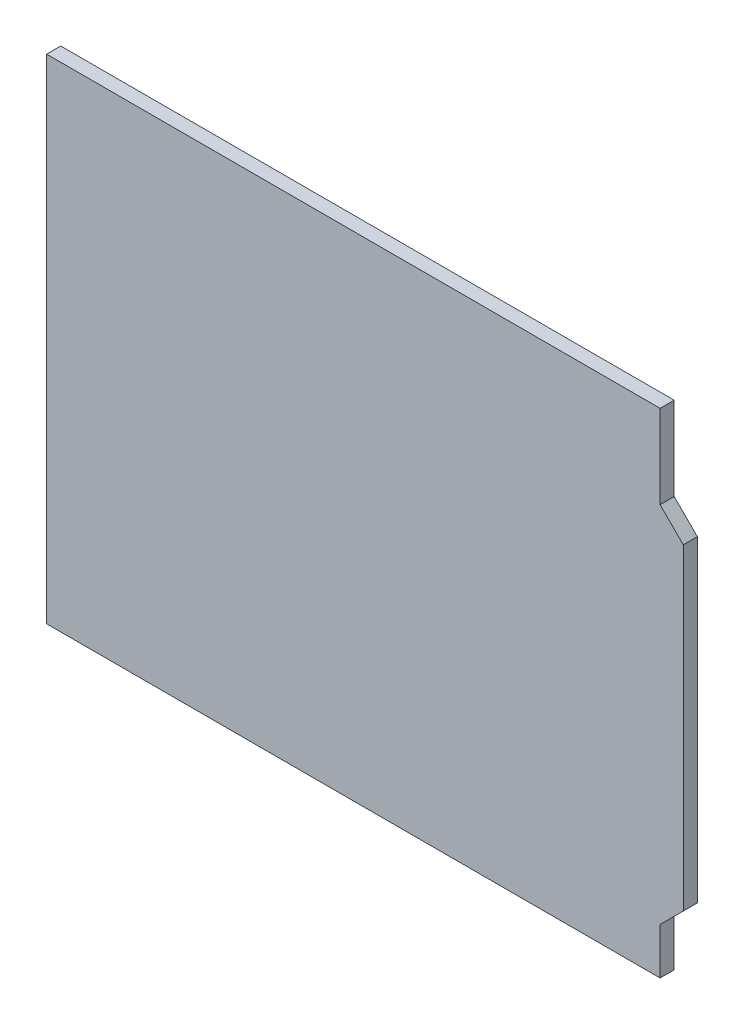
ISO-10303-21;
HEADER;
FILE_DESCRIPTION(('STEP AP214'),'2;1');
FILE_NAME('part.step','',(''),(''),'','','');
FILE_SCHEMA(('AUTOMOTIVE_DESIGN { 1 0 10303 214 1 1 1 1 }'));
ENDSEC;
DATA;
#1=APPLICATION_CONTEXT('core data for automotive mechanical design processes');
#2=APPLICATION_PROTOCOL_DEFINITION('international standard','automotive_design',2000,#1);
#3=PRODUCT_CONTEXT('',#1,'mechanical');
#4=PRODUCT('Part','Part','',(#3));
#5=PRODUCT_RELATED_PRODUCT_CATEGORY('part','',(#4));
#6=PRODUCT_DEFINITION_FORMATION('','',#4);
#7=PRODUCT_DEFINITION_CONTEXT('part definition',#1,'design');
#8=PRODUCT_DEFINITION('design','',#6,#7);
#9=PRODUCT_DEFINITION_SHAPE('','',#8);
#10=(LENGTH_UNIT() NAMED_UNIT(*) SI_UNIT(.MILLI.,.METRE.));
#11=(NAMED_UNIT(*) PLANE_ANGLE_UNIT() SI_UNIT($,.RADIAN.));
#12=(NAMED_UNIT(*) SI_UNIT($,.STERADIAN.) SOLID_ANGLE_UNIT());
#13=UNCERTAINTY_MEASURE_WITH_UNIT(LENGTH_MEASURE(1.E-05),#10,'distance_accuracy_value','');
#14=(GEOMETRIC_REPRESENTATION_CONTEXT(3) GLOBAL_UNCERTAINTY_ASSIGNED_CONTEXT((#13)) GLOBAL_UNIT_ASSIGNED_CONTEXT((#10,
#11,#12)) REPRESENTATION_CONTEXT('',''));
#15=CARTESIAN_POINT('',(0.,0.,0.));
#16=DIRECTION('',(0.,0.,1.));
#17=DIRECTION('',(1.,0.,0.));
#18=AXIS2_PLACEMENT_3D('',#15,#16,#17);
#19=CARTESIAN_POINT('',(-68.66,0.,1.52));
#20=DIRECTION('',(1.,0.,0.));
#21=DIRECTION('',(0.,0.,-1.));
#22=AXIS2_PLACEMENT_3D('',#19,#20,#21);
#23=PLANE('',#22);
#24=DIRECTION('',(0.,-1.,0.));
#25=VECTOR('',#24,1.);
#26=CARTESIAN_POINT('',(-68.66,0.,0.));
#27=LINE('',#26,#25);
#28=CARTESIAN_POINT('',(-68.66,53.21,0.));
#29=VERTEX_POINT('',#28);
#30=CARTESIAN_POINT('',(-68.66,0.,0.));
#31=VERTEX_POINT('',#30);
#32=EDGE_CURVE('E129',#29,#31,#27,.T.);
#33=ORIENTED_EDGE('',*,*,#32,.T.);
#34=DIRECTION('',(0.,0.,-1.));
#35=VECTOR('',#34,1.);
#36=CARTESIAN_POINT('',(-68.66,0.,1.52));
#37=LINE('',#36,#35);
#38=CARTESIAN_POINT('',(-68.66,0.,1.52));
#39=VERTEX_POINT('',#38);
#40=EDGE_CURVE('E11',#39,#31,#37,.T.);
#41=ORIENTED_EDGE('',*,*,#40,.F.);
#42=DIRECTION('',(0.,-1.,0.));
#43=VECTOR('',#42,1.);
#44=CARTESIAN_POINT('',(-68.66,0.,1.52));
#45=LINE('',#44,#43);
#46=CARTESIAN_POINT('',(-68.66,53.21,1.52));
#47=VERTEX_POINT('',#46);
#48=EDGE_CURVE('E143',#47,#39,#45,.T.);
#49=ORIENTED_EDGE('',*,*,#48,.F.);
#50=DIRECTION('',(0.,0.,-1.));
#51=VECTOR('',#50,1.);
#52=CARTESIAN_POINT('',(-68.66,53.21,1.52));
#53=LINE('',#52,#51);
#54=EDGE_CURVE('E125',#47,#29,#53,.T.);
#55=ORIENTED_EDGE('',*,*,#54,.T.);
#56=EDGE_LOOP('',(#33,#41,#49,#55));
#57=FACE_BOUND('',#56,.T.);
#58=ADVANCED_FACE('F33',(#57),#23,.F.);
#59=CARTESIAN_POINT('',(-2.5,0.,1.52));
#60=DIRECTION('',(0.,1.,0.));
#61=DIRECTION('',(-1.,0.,0.));
#62=AXIS2_PLACEMENT_3D('',#59,#60,#61);
#63=PLANE('',#62);
#64=DIRECTION('',(1.,0.,0.));
#65=VECTOR('',#64,1.);
#66=CARTESIAN_POINT('',(-2.5,0.,0.));
#67=LINE('',#66,#65);
#68=CARTESIAN_POINT('',(-2.5,0.,0.));
#69=VERTEX_POINT('',#68);
#70=EDGE_CURVE('E132',#31,#69,#67,.T.);
#71=ORIENTED_EDGE('',*,*,#70,.T.);
#72=DIRECTION('',(0.,0.,-1.));
#73=VECTOR('',#72,1.);
#74=CARTESIAN_POINT('',(-2.5,0.,1.52));
#75=LINE('',#74,#73);
#76=CARTESIAN_POINT('',(-2.5,0.,1.52));
#77=VERTEX_POINT('',#76);
#78=EDGE_CURVE('E41',#77,#69,#75,.T.);
#79=ORIENTED_EDGE('',*,*,#78,.F.);
#80=DIRECTION('',(1.,0.,0.));
#81=VECTOR('',#80,1.);
#82=CARTESIAN_POINT('',(-2.5,0.,1.52));
#83=LINE('',#82,#81);
#84=EDGE_CURVE('E92',#39,#77,#83,.T.);
#85=ORIENTED_EDGE('',*,*,#84,.F.);
#86=ORIENTED_EDGE('',*,*,#40,.T.);
#87=EDGE_LOOP('',(#71,#79,#85,#86));
#88=FACE_BOUND('',#87,.T.);
#89=ADVANCED_FACE('F178',(#88),#63,.F.);
#90=CARTESIAN_POINT('',(-2.5,0.,1.52));
#91=DIRECTION('',(-1.,0.,0.));
#92=DIRECTION('',(0.,0.,1.));
#93=AXIS2_PLACEMENT_3D('',#90,#91,#92);
#94=PLANE('',#93);
#95=DIRECTION('',(0.,1.,0.));
#96=VECTOR('',#95,1.);
#97=CARTESIAN_POINT('',(-2.5,0.,0.));
#98=LINE('',#97,#96);
#99=CARTESIAN_POINT('',(-2.5,5.,0.));
#100=VERTEX_POINT('',#99);
#101=EDGE_CURVE('E134',#69,#100,#98,.T.);
#102=ORIENTED_EDGE('',*,*,#101,.T.);
#103=DIRECTION('',(0.,0.,-1.));
#104=VECTOR('',#103,1.);
#105=CARTESIAN_POINT('',(-2.5,5.,1.52));
#106=LINE('',#105,#104);
#107=CARTESIAN_POINT('',(-2.5,5.,1.52));
#108=VERTEX_POINT('',#107);
#109=EDGE_CURVE('E150',#108,#100,#106,.T.);
#110=ORIENTED_EDGE('',*,*,#109,.F.);
#111=DIRECTION('',(0.,1.,0.));
#112=VECTOR('',#111,1.);
#113=CARTESIAN_POINT('',(-2.5,0.,1.52));
#114=LINE('',#113,#112);
#115=EDGE_CURVE('E158',#77,#108,#114,.T.);
#116=ORIENTED_EDGE('',*,*,#115,.F.);
#117=ORIENTED_EDGE('',*,*,#78,.T.);
#118=EDGE_LOOP('',(#102,#110,#116,#117));
#119=FACE_BOUND('',#118,.T.);
#120=ADVANCED_FACE('F156',(#119),#94,.F.);
#121=CARTESIAN_POINT('',(-2.5,5.,1.52));
#122=DIRECTION('',(-0.707106781186549,0.707106781186546,0.));
#123=DIRECTION('',(-0.707106781186546,-0.707106781186549,0.));
#124=AXIS2_PLACEMENT_3D('',#121,#122,#123);
#125=PLANE('',#124);
#126=DIRECTION('',(0.707106781186546,0.707106781186549,0.));
#127=VECTOR('',#126,1.);
#128=CARTESIAN_POINT('',(-2.5,5.,0.));
#129=LINE('',#128,#127);
#130=CARTESIAN_POINT('',(0.,7.50000000000001,0.));
#131=VERTEX_POINT('',#130);
#132=EDGE_CURVE('E136',#100,#131,#129,.T.);
#133=ORIENTED_EDGE('',*,*,#132,.T.);
#134=DIRECTION('',(0.,0.,-1.));
#135=VECTOR('',#134,1.);
#136=CARTESIAN_POINT('',(0.,7.50000000000001,1.52));
#137=LINE('',#136,#135);
#138=CARTESIAN_POINT('',(0.,7.50000000000001,1.52));
#139=VERTEX_POINT('',#138);
#140=EDGE_CURVE('E147',#139,#131,#137,.T.);
#141=ORIENTED_EDGE('',*,*,#140,.F.);
#142=DIRECTION('',(0.707106781186546,0.707106781186549,0.));
#143=VECTOR('',#142,1.);
#144=CARTESIAN_POINT('',(-2.5,5.,1.52));
#145=LINE('',#144,#143);
#146=EDGE_CURVE('E170',#108,#139,#145,.T.);
#147=ORIENTED_EDGE('',*,*,#146,.F.);
#148=ORIENTED_EDGE('',*,*,#109,.T.);
#149=EDGE_LOOP('',(#133,#141,#147,#148));
#150=FACE_BOUND('',#149,.T.);
#151=ADVANCED_FACE('F166',(#150),#125,.F.);
#152=CARTESIAN_POINT('',(0.,7.50000000000001,1.52));
#153=DIRECTION('',(-1.,0.,0.));
#154=DIRECTION('',(0.,-1.,0.));
#155=AXIS2_PLACEMENT_3D('',#152,#153,#154);
#156=PLANE('',#155);
#157=DIRECTION('',(0.,1.,0.));
#158=VECTOR('',#157,1.);
#159=CARTESIAN_POINT('',(0.,7.50000000000001,0.));
#160=LINE('',#159,#158);
#161=CARTESIAN_POINT('',(0.,41.7100000000001,0.));
#162=VERTEX_POINT('',#161);
#163=EDGE_CURVE('E138',#131,#162,#160,.T.);
#164=ORIENTED_EDGE('',*,*,#163,.T.);
#165=DIRECTION('',(0.,0.,-1.));
#166=VECTOR('',#165,1.);
#167=CARTESIAN_POINT('',(0.,41.7100000000001,1.52));
#168=LINE('',#167,#166);
#169=CARTESIAN_POINT('',(0.,41.7100000000001,1.52));
#170=VERTEX_POINT('',#169);
#171=EDGE_CURVE('E120',#170,#162,#168,.T.);
#172=ORIENTED_EDGE('',*,*,#171,.F.);
#173=DIRECTION('',(0.,1.,0.));
#174=VECTOR('',#173,1.);
#175=CARTESIAN_POINT('',(0.,7.50000000000001,1.52));
#176=LINE('',#175,#174);
#177=EDGE_CURVE('E111',#139,#170,#176,.T.);
#178=ORIENTED_EDGE('',*,*,#177,.F.);
#179=ORIENTED_EDGE('',*,*,#140,.T.);
#180=EDGE_LOOP('',(#164,#172,#178,#179));
#181=FACE_BOUND('',#180,.T.);
#182=ADVANCED_FACE('F169',(#181),#156,.F.);
#183=CARTESIAN_POINT('',(-2.5,44.21,1.52));
#184=DIRECTION('',(-0.707106781186538,-0.707106781186557,0.));
#185=DIRECTION('',(0.707106781186557,-0.707106781186538,0.));
#186=AXIS2_PLACEMENT_3D('',#183,#184,#185);
#187=PLANE('',#186);
#188=DIRECTION('',(-0.707106781186557,0.707106781186539,0.));
#189=VECTOR('',#188,1.);
#190=CARTESIAN_POINT('',(-2.5,44.21,0.));
#191=LINE('',#190,#189);
#192=CARTESIAN_POINT('',(-2.5,44.21,0.));
#193=VERTEX_POINT('',#192);
#194=EDGE_CURVE('E119',#162,#193,#191,.T.);
#195=ORIENTED_EDGE('',*,*,#194,.T.);
#196=DIRECTION('',(0.,0.,-1.));
#197=VECTOR('',#196,1.);
#198=CARTESIAN_POINT('',(-2.5,44.21,1.52));
#199=LINE('',#198,#197);
#200=CARTESIAN_POINT('',(-2.5,44.21,1.52));
#201=VERTEX_POINT('',#200);
#202=EDGE_CURVE('E116',#201,#193,#199,.T.);
#203=ORIENTED_EDGE('',*,*,#202,.F.);
#204=DIRECTION('',(-0.707106781186557,0.707106781186539,0.));
#205=VECTOR('',#204,1.);
#206=CARTESIAN_POINT('',(-2.5,44.21,1.52));
#207=LINE('',#206,#205);
#208=EDGE_CURVE('E105',#170,#201,#207,.T.);
#209=ORIENTED_EDGE('',*,*,#208,.F.);
#210=ORIENTED_EDGE('',*,*,#171,.T.);
#211=EDGE_LOOP('',(#195,#203,#209,#210));
#212=FACE_BOUND('',#211,.T.);
#213=ADVANCED_FACE('F117',(#212),#187,.F.);
#214=CARTESIAN_POINT('',(-2.5,53.21,1.52));
#215=DIRECTION('',(-1.,0.,0.));
#216=DIRECTION('',(0.,-1.,0.));
#217=AXIS2_PLACEMENT_3D('',#214,#215,#216);
#218=PLANE('',#217);
#219=DIRECTION('',(0.,1.,0.));
#220=VECTOR('',#219,1.);
#221=CARTESIAN_POINT('',(-2.5,53.21,0.));
#222=LINE('',#221,#220);
#223=CARTESIAN_POINT('',(-2.5,53.21,0.));
#224=VERTEX_POINT('',#223);
#225=EDGE_CURVE('E78',#193,#224,#222,.T.);
#226=ORIENTED_EDGE('',*,*,#225,.T.);
#227=DIRECTION('',(0.,0.,-1.));
#228=VECTOR('',#227,1.);
#229=CARTESIAN_POINT('',(-2.5,53.21,1.52));
#230=LINE('',#229,#228);
#231=CARTESIAN_POINT('',(-2.5,53.21,1.52));
#232=VERTEX_POINT('',#231);
#233=EDGE_CURVE('E121',#232,#224,#230,.T.);
#234=ORIENTED_EDGE('',*,*,#233,.F.);
#235=DIRECTION('',(0.,1.,0.));
#236=VECTOR('',#235,1.);
#237=CARTESIAN_POINT('',(-2.5,53.21,1.52));
#238=LINE('',#237,#236);
#239=EDGE_CURVE('E109',#201,#232,#238,.T.);
#240=ORIENTED_EDGE('',*,*,#239,.F.);
#241=ORIENTED_EDGE('',*,*,#202,.T.);
#242=EDGE_LOOP('',(#226,#234,#240,#241));
#243=FACE_BOUND('',#242,.T.);
#244=ADVANCED_FACE('F123',(#243),#218,.F.);
#245=CARTESIAN_POINT('',(-2.5,53.21,1.52));
#246=DIRECTION('',(0.,-1.,0.));
#247=DIRECTION('',(1.,0.,0.));
#248=AXIS2_PLACEMENT_3D('',#245,#246,#247);
#249=PLANE('',#248);
#250=DIRECTION('',(-1.,0.,0.));
#251=VECTOR('',#250,1.);
#252=CARTESIAN_POINT('',(-2.5,53.21,0.));
#253=LINE('',#252,#251);
#254=EDGE_CURVE('E84',#224,#29,#253,.T.);
#255=ORIENTED_EDGE('',*,*,#254,.T.);
#256=ORIENTED_EDGE('',*,*,#54,.F.);
#257=DIRECTION('',(-1.,0.,0.));
#258=VECTOR('',#257,1.);
#259=CARTESIAN_POINT('',(-2.5,53.21,1.52));
#260=LINE('',#259,#258);
#261=EDGE_CURVE('E49',#232,#47,#260,.T.);
#262=ORIENTED_EDGE('',*,*,#261,.F.);
#263=ORIENTED_EDGE('',*,*,#233,.T.);
#264=EDGE_LOOP('',(#255,#256,#262,#263));
#265=FACE_BOUND('',#264,.T.);
#266=ADVANCED_FACE('F194',(#265),#249,.F.);
#267=CARTESIAN_POINT('',(0.,0.,1.52));
#268=DIRECTION('',(0.,0.,1.));
#269=DIRECTION('',(1.,0.,0.));
#270=AXIS2_PLACEMENT_3D('',#267,#268,#269);
#271=PLANE('',#270);
#272=ORIENTED_EDGE('',*,*,#48,.T.);
#273=ORIENTED_EDGE('',*,*,#84,.T.);
#274=ORIENTED_EDGE('',*,*,#115,.T.);
#275=ORIENTED_EDGE('',*,*,#146,.T.);
#276=ORIENTED_EDGE('',*,*,#177,.T.);
#277=ORIENTED_EDGE('',*,*,#208,.T.);
#278=ORIENTED_EDGE('',*,*,#239,.T.);
#279=ORIENTED_EDGE('',*,*,#261,.T.);
#280=EDGE_LOOP('',(#272,#273,#274,#275,#276,#277,#278,#279));
#281=FACE_BOUND('',#280,.T.);
#282=ADVANCED_FACE('F107',(#281),#271,.T.);
#283=CARTESIAN_POINT('',(0.,0.,0.));
#284=DIRECTION('',(0.,0.,1.));
#285=DIRECTION('',(1.,0.,0.));
#286=AXIS2_PLACEMENT_3D('',#283,#284,#285);
#287=PLANE('',#286);
#288=ORIENTED_EDGE('',*,*,#32,.F.);
#289=ORIENTED_EDGE('',*,*,#254,.F.);
#290=ORIENTED_EDGE('',*,*,#225,.F.);
#291=ORIENTED_EDGE('',*,*,#194,.F.);
#292=ORIENTED_EDGE('',*,*,#163,.F.);
#293=ORIENTED_EDGE('',*,*,#132,.F.);
#294=ORIENTED_EDGE('',*,*,#101,.F.);
#295=ORIENTED_EDGE('',*,*,#70,.F.);
#296=EDGE_LOOP('',(#288,#289,#290,#291,#292,#293,#294,#295));
#297=FACE_BOUND('',#296,.T.);
#298=ADVANCED_FACE('F162',(#297),#287,.F.);
#299=CLOSED_SHELL('',(#58,#89,#120,#151,#182,#213,#244,#266,#282,#298));
#300=MANIFOLD_SOLID_BREP('B2',#299);
#301=ADVANCED_BREP_SHAPE_REPRESENTATION('',(#18,#300),#14);
#302=SHAPE_DEFINITION_REPRESENTATION(#9,#301);
ENDSEC;
END-ISO-10303-21;
